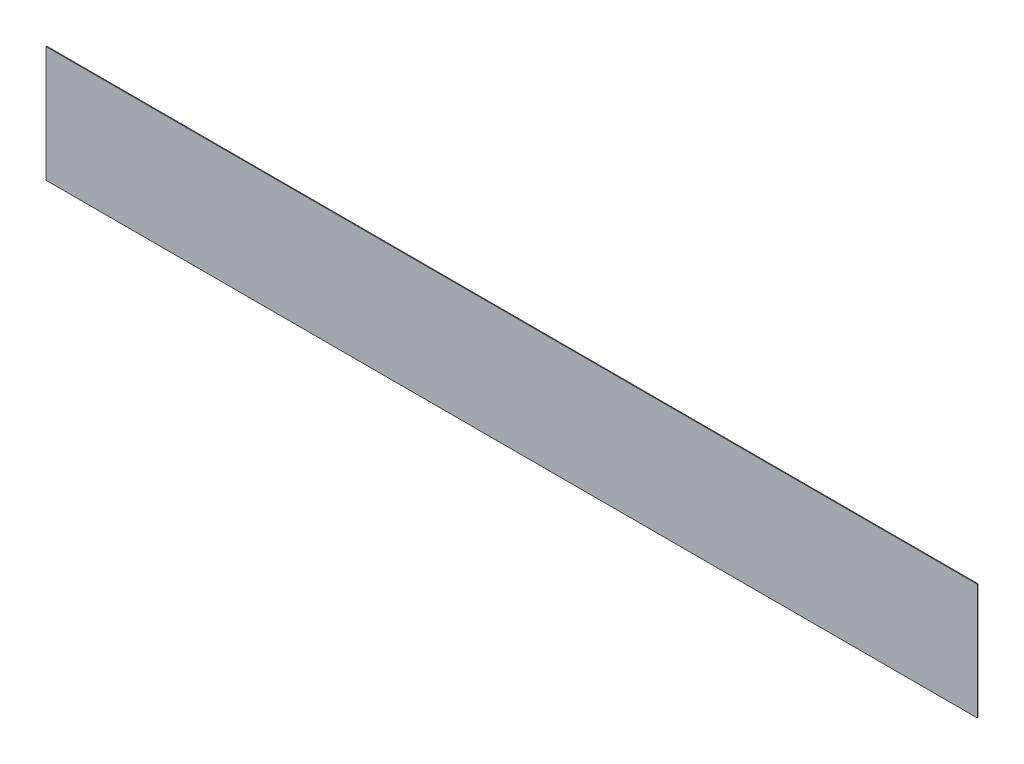
ISO-10303-21;
HEADER;
FILE_DESCRIPTION(('STEP AP214'),'2;1');
FILE_NAME('part.step','',(''),(''),'','','');
FILE_SCHEMA(('AUTOMOTIVE_DESIGN { 1 0 10303 214 1 1 1 1 }'));
ENDSEC;
DATA;
#1=APPLICATION_CONTEXT('core data for automotive mechanical design processes');
#2=APPLICATION_PROTOCOL_DEFINITION('international standard','automotive_design',2000,#1);
#3=PRODUCT_CONTEXT('',#1,'mechanical');
#4=PRODUCT('Part','Part','',(#3));
#5=PRODUCT_RELATED_PRODUCT_CATEGORY('part','',(#4));
#6=PRODUCT_DEFINITION_FORMATION('','',#4);
#7=PRODUCT_DEFINITION_CONTEXT('part definition',#1,'design');
#8=PRODUCT_DEFINITION('design','',#6,#7);
#9=PRODUCT_DEFINITION_SHAPE('','',#8);
#10=(LENGTH_UNIT() NAMED_UNIT(*) SI_UNIT(.MILLI.,.METRE.));
#11=(NAMED_UNIT(*) PLANE_ANGLE_UNIT() SI_UNIT($,.RADIAN.));
#12=(NAMED_UNIT(*) SI_UNIT($,.STERADIAN.) SOLID_ANGLE_UNIT());
#13=UNCERTAINTY_MEASURE_WITH_UNIT(LENGTH_MEASURE(1.E-05),#10,'distance_accuracy_value','');
#14=(GEOMETRIC_REPRESENTATION_CONTEXT(3) GLOBAL_UNCERTAINTY_ASSIGNED_CONTEXT((#13)) GLOBAL_UNIT_ASSIGNED_CONTEXT((#10,
#11,#12)) REPRESENTATION_CONTEXT('',''));
#15=CARTESIAN_POINT('',(0.,0.,0.));
#16=DIRECTION('',(0.,0.,1.));
#17=DIRECTION('',(1.,0.,0.));
#18=AXIS2_PLACEMENT_3D('',#15,#16,#17);
#19=CARTESIAN_POINT('',(2500.,311.000000000001,2.));
#20=DIRECTION('',(0.,-1.,0.));
#21=DIRECTION('',(1.,0.,0.));
#22=AXIS2_PLACEMENT_3D('',#19,#20,#21);
#23=PLANE('',#22);
#24=DIRECTION('',(-1.,0.,0.));
#25=VECTOR('',#24,1.);
#26=CARTESIAN_POINT('',(2500.,311.000000000001,0.));
#27=LINE('',#26,#25);
#28=CARTESIAN_POINT('',(2500.,311.000000000001,0.));
#29=VERTEX_POINT('',#28);
#30=CARTESIAN_POINT('',(0.,311.,0.));
#31=VERTEX_POINT('',#30);
#32=EDGE_CURVE('E109',#29,#31,#27,.T.);
#33=ORIENTED_EDGE('',*,*,#32,.T.);
#34=DIRECTION('',(0.,0.,-1.));
#35=VECTOR('',#34,1.);
#36=CARTESIAN_POINT('',(0.,311.,2.));
#37=LINE('',#36,#35);
#38=CARTESIAN_POINT('',(0.,311.,2.));
#39=VERTEX_POINT('',#38);
#40=EDGE_CURVE('E11',#39,#31,#37,.T.);
#41=ORIENTED_EDGE('',*,*,#40,.F.);
#42=DIRECTION('',(-1.,0.,0.));
#43=VECTOR('',#42,1.);
#44=CARTESIAN_POINT('',(2500.,311.000000000001,2.));
#45=LINE('',#44,#43);
#46=CARTESIAN_POINT('',(2500.,311.000000000001,2.));
#47=VERTEX_POINT('',#46);
#48=EDGE_CURVE('E93',#47,#39,#45,.T.);
#49=ORIENTED_EDGE('',*,*,#48,.F.);
#50=DIRECTION('',(0.,0.,-1.));
#51=VECTOR('',#50,1.);
#52=CARTESIAN_POINT('',(2500.,311.000000000001,2.));
#53=LINE('',#52,#51);
#54=EDGE_CURVE('E105',#47,#29,#53,.T.);
#55=ORIENTED_EDGE('',*,*,#54,.T.);
#56=EDGE_LOOP('',(#33,#41,#49,#55));
#57=FACE_BOUND('',#56,.T.);
#58=ADVANCED_FACE('F41',(#57),#23,.F.);
#59=CARTESIAN_POINT('',(0.,311.,2.));
#60=DIRECTION('',(1.,0.,0.));
#61=DIRECTION('',(0.,1.,0.));
#62=AXIS2_PLACEMENT_3D('',#59,#60,#61);
#63=PLANE('',#62);
#64=DIRECTION('',(0.,-1.,0.));
#65=VECTOR('',#64,1.);
#66=CARTESIAN_POINT('',(0.,311.,0.));
#67=LINE('',#66,#65);
#68=CARTESIAN_POINT('',(0.,0.,0.));
#69=VERTEX_POINT('',#68);
#70=EDGE_CURVE('E98',#31,#69,#67,.T.);
#71=ORIENTED_EDGE('',*,*,#70,.T.);
#72=DIRECTION('',(0.,0.,-1.));
#73=VECTOR('',#72,1.);
#74=CARTESIAN_POINT('',(0.,0.,2.));
#75=LINE('',#74,#73);
#76=CARTESIAN_POINT('',(0.,0.,2.));
#77=VERTEX_POINT('',#76);
#78=EDGE_CURVE('E50',#77,#69,#75,.T.);
#79=ORIENTED_EDGE('',*,*,#78,.F.);
#80=DIRECTION('',(0.,-1.,0.));
#81=VECTOR('',#80,1.);
#82=CARTESIAN_POINT('',(0.,311.,2.));
#83=LINE('',#82,#81);
#84=EDGE_CURVE('E88',#39,#77,#83,.T.);
#85=ORIENTED_EDGE('',*,*,#84,.F.);
#86=ORIENTED_EDGE('',*,*,#40,.T.);
#87=EDGE_LOOP('',(#71,#79,#85,#86));
#88=FACE_BOUND('',#87,.T.);
#89=ADVANCED_FACE('F97',(#88),#63,.F.);
#90=CARTESIAN_POINT('',(2500.,4.59242549680257E-13,2.));
#91=DIRECTION('',(0.,1.,0.));
#92=DIRECTION('',(-1.,0.,0.));
#93=AXIS2_PLACEMENT_3D('',#90,#91,#92);
#94=PLANE('',#93);
#95=DIRECTION('',(1.,0.,0.));
#96=VECTOR('',#95,1.);
#97=CARTESIAN_POINT('',(2500.,4.59242549680257E-13,0.));
#98=LINE('',#97,#96);
#99=CARTESIAN_POINT('',(2500.,4.59242549680257E-13,0.));
#100=VERTEX_POINT('',#99);
#101=EDGE_CURVE('E75',#69,#100,#98,.T.);
#102=ORIENTED_EDGE('',*,*,#101,.T.);
#103=DIRECTION('',(0.,0.,-1.));
#104=VECTOR('',#103,1.);
#105=CARTESIAN_POINT('',(2500.,4.59242549680257E-13,2.));
#106=LINE('',#105,#104);
#107=CARTESIAN_POINT('',(2500.,4.59242549680257E-13,2.));
#108=VERTEX_POINT('',#107);
#109=EDGE_CURVE('E100',#108,#100,#106,.T.);
#110=ORIENTED_EDGE('',*,*,#109,.F.);
#111=DIRECTION('',(1.,0.,0.));
#112=VECTOR('',#111,1.);
#113=CARTESIAN_POINT('',(2500.,4.59242549680257E-13,2.));
#114=LINE('',#113,#112);
#115=EDGE_CURVE('E91',#77,#108,#114,.T.);
#116=ORIENTED_EDGE('',*,*,#115,.F.);
#117=ORIENTED_EDGE('',*,*,#78,.T.);
#118=EDGE_LOOP('',(#102,#110,#116,#117));
#119=FACE_BOUND('',#118,.T.);
#120=ADVANCED_FACE('F101',(#119),#94,.F.);
#121=CARTESIAN_POINT('',(2500.,311.000000000001,2.));
#122=DIRECTION('',(-1.,0.,0.));
#123=DIRECTION('',(0.,0.,1.));
#124=AXIS2_PLACEMENT_3D('',#121,#122,#123);
#125=PLANE('',#124);
#126=DIRECTION('',(0.,1.,0.));
#127=VECTOR('',#126,1.);
#128=CARTESIAN_POINT('',(2500.,311.000000000001,0.));
#129=LINE('',#128,#127);
#130=EDGE_CURVE('E81',#100,#29,#129,.T.);
#131=ORIENTED_EDGE('',*,*,#130,.T.);
#132=ORIENTED_EDGE('',*,*,#54,.F.);
#133=DIRECTION('',(0.,1.,0.));
#134=VECTOR('',#133,1.);
#135=CARTESIAN_POINT('',(2500.,311.000000000001,2.));
#136=LINE('',#135,#134);
#137=EDGE_CURVE('E58',#108,#47,#136,.T.);
#138=ORIENTED_EDGE('',*,*,#137,.F.);
#139=ORIENTED_EDGE('',*,*,#109,.T.);
#140=EDGE_LOOP('',(#131,#132,#138,#139));
#141=FACE_BOUND('',#140,.T.);
#142=ADVANCED_FACE('F122',(#141),#125,.F.);
#143=CARTESIAN_POINT('',(0.,0.,2.));
#144=DIRECTION('',(0.,0.,1.));
#145=DIRECTION('',(1.,0.,0.));
#146=AXIS2_PLACEMENT_3D('',#143,#144,#145);
#147=PLANE('',#146);
#148=ORIENTED_EDGE('',*,*,#48,.T.);
#149=ORIENTED_EDGE('',*,*,#84,.T.);
#150=ORIENTED_EDGE('',*,*,#115,.T.);
#151=ORIENTED_EDGE('',*,*,#137,.T.);
#152=EDGE_LOOP('',(#148,#149,#150,#151));
#153=FACE_BOUND('',#152,.T.);
#154=ADVANCED_FACE('F89',(#153),#147,.T.);
#155=CARTESIAN_POINT('',(0.,0.,0.));
#156=DIRECTION('',(0.,0.,1.));
#157=DIRECTION('',(1.,0.,0.));
#158=AXIS2_PLACEMENT_3D('',#155,#156,#157);
#159=PLANE('',#158);
#160=ORIENTED_EDGE('',*,*,#32,.F.);
#161=ORIENTED_EDGE('',*,*,#130,.F.);
#162=ORIENTED_EDGE('',*,*,#101,.F.);
#163=ORIENTED_EDGE('',*,*,#70,.F.);
#164=EDGE_LOOP('',(#160,#161,#162,#163));
#165=FACE_BOUND('',#164,.T.);
#166=ADVANCED_FACE('F125',(#165),#159,.F.);
#167=CLOSED_SHELL('',(#58,#89,#120,#142,#154,#166));
#168=MANIFOLD_SOLID_BREP('B2',#167);
#169=ADVANCED_BREP_SHAPE_REPRESENTATION('',(#18,#168),#14);
#170=SHAPE_DEFINITION_REPRESENTATION(#9,#169);
ENDSEC;
END-ISO-10303-21;
